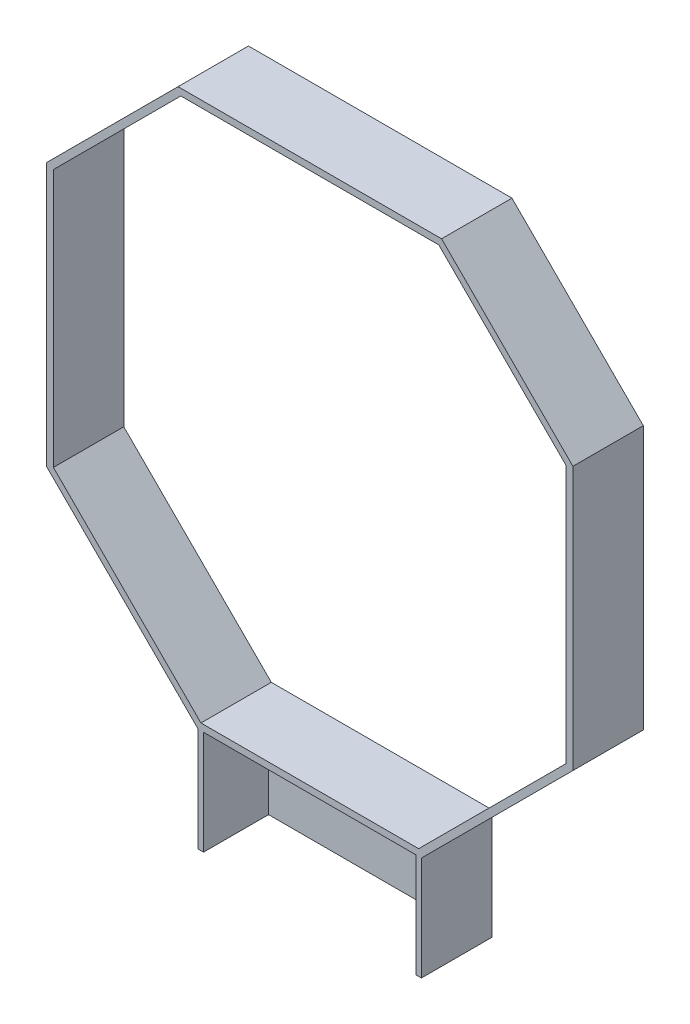
ISO-10303-21;
HEADER;
FILE_DESCRIPTION(('STEP AP214'),'2;1');
FILE_NAME('part.step','',(''),(''),'','','');
FILE_SCHEMA(('AUTOMOTIVE_DESIGN { 1 0 10303 214 1 1 1 1 }'));
ENDSEC;
DATA;
#1=APPLICATION_CONTEXT('core data for automotive mechanical design processes');
#2=APPLICATION_PROTOCOL_DEFINITION('international standard','automotive_design',2000,#1);
#3=PRODUCT_CONTEXT('',#1,'mechanical');
#4=PRODUCT('Part','Part','',(#3));
#5=PRODUCT_RELATED_PRODUCT_CATEGORY('part','',(#4));
#6=PRODUCT_DEFINITION_FORMATION('','',#4);
#7=PRODUCT_DEFINITION_CONTEXT('part definition',#1,'design');
#8=PRODUCT_DEFINITION('design','',#6,#7);
#9=PRODUCT_DEFINITION_SHAPE('','',#8);
#10=(LENGTH_UNIT() NAMED_UNIT(*) SI_UNIT(.MILLI.,.METRE.));
#11=(NAMED_UNIT(*) PLANE_ANGLE_UNIT() SI_UNIT($,.RADIAN.));
#12=(NAMED_UNIT(*) SI_UNIT($,.STERADIAN.) SOLID_ANGLE_UNIT());
#13=UNCERTAINTY_MEASURE_WITH_UNIT(LENGTH_MEASURE(1.E-05),#10,'distance_accuracy_value','');
#14=(GEOMETRIC_REPRESENTATION_CONTEXT(3) GLOBAL_UNCERTAINTY_ASSIGNED_CONTEXT((#13)) GLOBAL_UNIT_ASSIGNED_CONTEXT((#10,
#11,#12)) REPRESENTATION_CONTEXT('',''));
#15=CARTESIAN_POINT('',(0.,0.,0.));
#16=DIRECTION('',(0.,0.,1.));
#17=DIRECTION('',(1.,0.,0.));
#18=AXIS2_PLACEMENT_3D('',#15,#16,#17);
#19=CARTESIAN_POINT('',(21.125,20.375,4.5));
#20=DIRECTION('',(0.,0.,1.));
#21=DIRECTION('',(1.,0.,0.));
#22=AXIS2_PLACEMENT_3D('',#19,#20,#21);
#23=PLANE('',#22);
#24=DIRECTION('',(0.707106781186548,-0.707106781186548,0.));
#25=VECTOR('',#24,1.);
#26=CARTESIAN_POINT('',(30.7447961799572,40.25,4.5));
#27=LINE('',#26,#25);
#28=CARTESIAN_POINT('',(30.7447961799572,40.25,4.5));
#29=VERTEX_POINT('',#28);
#30=CARTESIAN_POINT('',(40.25,30.7447961799572,4.5));
#31=VERTEX_POINT('',#30);
#32=EDGE_CURVE('E286',#29,#31,#27,.T.);
#33=ORIENTED_EDGE('',*,*,#32,.F.);
#34=DIRECTION('',(1.,0.,0.));
#35=VECTOR('',#34,1.);
#36=CARTESIAN_POINT('',(11.5052038200428,40.25,4.5));
#37=LINE('',#36,#35);
#38=CARTESIAN_POINT('',(11.5052038200428,40.25,4.5));
#39=VERTEX_POINT('',#38);
#40=EDGE_CURVE('E322',#39,#29,#37,.T.);
#41=ORIENTED_EDGE('',*,*,#40,.F.);
#42=DIRECTION('',(0.707106781186548,0.707106781186547,0.));
#43=VECTOR('',#42,1.);
#44=CARTESIAN_POINT('',(2.,30.7447961799572,4.5));
#45=LINE('',#44,#43);
#46=CARTESIAN_POINT('',(2.,30.7447961799572,4.5));
#47=VERTEX_POINT('',#46);
#48=EDGE_CURVE('E398',#47,#39,#45,.T.);
#49=ORIENTED_EDGE('',*,*,#48,.F.);
#50=DIRECTION('',(0.,1.,0.));
#51=VECTOR('',#50,1.);
#52=CARTESIAN_POINT('',(2.,11.5052038200428,4.5));
#53=LINE('',#52,#51);
#54=CARTESIAN_POINT('',(2.,11.5052038200428,4.5));
#55=VERTEX_POINT('',#54);
#56=EDGE_CURVE('E221',#55,#47,#53,.T.);
#57=ORIENTED_EDGE('',*,*,#56,.F.);
#58=DIRECTION('',(-0.707106781186548,0.707106781186547,0.));
#59=VECTOR('',#58,1.);
#60=CARTESIAN_POINT('',(13.0052038200428,0.5,4.5));
#61=LINE('',#60,#59);
#62=CARTESIAN_POINT('',(13.0052038200428,0.5,4.5));
#63=VERTEX_POINT('',#62);
#64=EDGE_CURVE('E189',#63,#55,#61,.T.);
#65=ORIENTED_EDGE('',*,*,#64,.F.);
#66=DIRECTION('',(-1.,0.,0.));
#67=VECTOR('',#66,1.);
#68=CARTESIAN_POINT('',(29.2447961799572,0.5,4.5));
#69=LINE('',#68,#67);
#70=CARTESIAN_POINT('',(29.2447961799572,0.5,4.5));
#71=VERTEX_POINT('',#70);
#72=EDGE_CURVE('E207',#71,#63,#69,.T.);
#73=ORIENTED_EDGE('',*,*,#72,.F.);
#74=DIRECTION('',(-0.707106781186548,-0.707106781186547,0.));
#75=VECTOR('',#74,1.);
#76=CARTESIAN_POINT('',(40.25,11.5052038200428,4.5));
#77=LINE('',#76,#75);
#78=CARTESIAN_POINT('',(40.25,11.5052038200428,4.5));
#79=VERTEX_POINT('',#78);
#80=EDGE_CURVE('E346',#79,#71,#77,.T.);
#81=ORIENTED_EDGE('',*,*,#80,.F.);
#82=DIRECTION('',(0.,-1.,0.));
#83=VECTOR('',#82,1.);
#84=CARTESIAN_POINT('',(40.25,30.7447961799572,4.5));
#85=LINE('',#84,#83);
#86=EDGE_CURVE('E271',#31,#79,#85,.T.);
#87=ORIENTED_EDGE('',*,*,#86,.F.);
#88=EDGE_LOOP('',(#33,#41,#49,#57,#65,#73,#81,#87));
#89=FACE_BOUND('',#88,.T.);
#90=DIRECTION('',(0.,1.,0.));
#91=VECTOR('',#90,1.);
#92=CARTESIAN_POINT('',(1.5,11.2980970388563,4.5));
#93=LINE('',#92,#91);
#94=CARTESIAN_POINT('',(1.5,11.2980970388563,4.5));
#95=VERTEX_POINT('',#94);
#96=CARTESIAN_POINT('',(1.5,30.9519029611437,4.5));
#97=VERTEX_POINT('',#96);
#98=EDGE_CURVE('E28',#95,#97,#93,.T.);
#99=ORIENTED_EDGE('',*,*,#98,.T.);
#100=DIRECTION('',(0.707106781186548,0.707106781186547,0.));
#101=VECTOR('',#100,1.);
#102=CARTESIAN_POINT('',(1.5,30.9519029611437,4.5));
#103=LINE('',#102,#101);
#104=CARTESIAN_POINT('',(11.2980970388563,40.75,4.5));
#105=VERTEX_POINT('',#104);
#106=EDGE_CURVE('E200',#97,#105,#103,.T.);
#107=ORIENTED_EDGE('',*,*,#106,.T.);
#108=DIRECTION('',(1.,0.,0.));
#109=VECTOR('',#108,1.);
#110=CARTESIAN_POINT('',(11.2980970388563,40.75,4.5));
#111=LINE('',#110,#109);
#112=CARTESIAN_POINT('',(30.9519029611437,40.75,4.5));
#113=VERTEX_POINT('',#112);
#114=EDGE_CURVE('E244',#105,#113,#111,.T.);
#115=ORIENTED_EDGE('',*,*,#114,.T.);
#116=DIRECTION('',(0.707106781186548,-0.707106781186548,0.));
#117=VECTOR('',#116,1.);
#118=CARTESIAN_POINT('',(30.9519029611437,40.75,4.5));
#119=LINE('',#118,#117);
#120=CARTESIAN_POINT('',(40.75,30.9519029611437,4.5));
#121=VERTEX_POINT('',#120);
#122=EDGE_CURVE('E180',#113,#121,#119,.T.);
#123=ORIENTED_EDGE('',*,*,#122,.T.);
#124=DIRECTION('',(0.,-1.,0.));
#125=VECTOR('',#124,1.);
#126=CARTESIAN_POINT('',(40.75,30.9519029611437,4.5));
#127=LINE('',#126,#125);
#128=CARTESIAN_POINT('',(40.75,11.2980970388563,4.5));
#129=VERTEX_POINT('',#128);
#130=EDGE_CURVE('E164',#121,#129,#127,.T.);
#131=ORIENTED_EDGE('',*,*,#130,.T.);
#132=DIRECTION('',(-0.707106781186548,-0.707106781186547,0.));
#133=VECTOR('',#132,1.);
#134=CARTESIAN_POINT('',(40.75,11.2980970388563,4.5));
#135=LINE('',#134,#133);
#136=CARTESIAN_POINT('',(29.4519029611437,0.,4.5));
#137=VERTEX_POINT('',#136);
#138=EDGE_CURVE('E194',#129,#137,#135,.T.);
#139=ORIENTED_EDGE('',*,*,#138,.T.);
#140=DIRECTION('',(0.,-1.,0.));
#141=VECTOR('',#140,1.);
#142=CARTESIAN_POINT('',(29.4519029611437,0.,4.5));
#143=LINE('',#142,#141);
#144=CARTESIAN_POINT('',(29.4519029611437,-7.75,4.5));
#145=VERTEX_POINT('',#144);
#146=EDGE_CURVE('E327',#137,#145,#143,.T.);
#147=ORIENTED_EDGE('',*,*,#146,.T.);
#148=DIRECTION('',(1.,0.,0.));
#149=VECTOR('',#148,1.);
#150=CARTESIAN_POINT('',(12.7980970388563,-7.75,4.5));
#151=LINE('',#150,#149);
#152=CARTESIAN_POINT('',(12.7980970388563,-7.75,4.5));
#153=VERTEX_POINT('',#152);
#154=EDGE_CURVE('E215',#153,#145,#151,.T.);
#155=ORIENTED_EDGE('',*,*,#154,.F.);
#156=DIRECTION('',(0.,-1.,0.));
#157=VECTOR('',#156,1.);
#158=CARTESIAN_POINT('',(12.7980970388563,0.,4.5));
#159=LINE('',#158,#157);
#160=CARTESIAN_POINT('',(12.7980970388563,0.,4.5));
#161=VERTEX_POINT('',#160);
#162=EDGE_CURVE('E351',#161,#153,#159,.T.);
#163=ORIENTED_EDGE('',*,*,#162,.F.);
#164=DIRECTION('',(-0.707106781186548,0.707106781186547,0.));
#165=VECTOR('',#164,1.);
#166=CARTESIAN_POINT('',(12.7980970388563,0.,4.5));
#167=LINE('',#166,#165);
#168=EDGE_CURVE('E214',#161,#95,#167,.T.);
#169=ORIENTED_EDGE('',*,*,#168,.T.);
#170=EDGE_LOOP('',(#99,#107,#115,#123,#131,#139,#147,#155,#163,#169));
#171=FACE_BOUND('',#170,.T.);
#172=ADVANCED_FACE('F17',(#89,#171),#23,.F.);
#173=CARTESIAN_POINT('',(21.125,20.375,9.75));
#174=DIRECTION('',(0.,0.,1.));
#175=DIRECTION('',(1.,0.,0.));
#176=AXIS2_PLACEMENT_3D('',#173,#174,#175);
#177=PLANE('',#176);
#178=DIRECTION('',(0.707106781186548,-0.707106781186548,0.));
#179=VECTOR('',#178,1.);
#180=CARTESIAN_POINT('',(30.7447961799572,40.25,9.75));
#181=LINE('',#180,#179);
#182=CARTESIAN_POINT('',(30.7447961799572,40.25,9.75));
#183=VERTEX_POINT('',#182);
#184=CARTESIAN_POINT('',(40.25,30.7447961799572,9.75));
#185=VERTEX_POINT('',#184);
#186=EDGE_CURVE('E293',#183,#185,#181,.T.);
#187=ORIENTED_EDGE('',*,*,#186,.T.);
#188=DIRECTION('',(0.,-1.,0.));
#189=VECTOR('',#188,1.);
#190=CARTESIAN_POINT('',(40.25,30.7447961799572,9.75));
#191=LINE('',#190,#189);
#192=CARTESIAN_POINT('',(40.25,11.5052038200428,9.75));
#193=VERTEX_POINT('',#192);
#194=EDGE_CURVE('E287',#185,#193,#191,.T.);
#195=ORIENTED_EDGE('',*,*,#194,.T.);
#196=DIRECTION('',(-0.707106781186548,-0.707106781186547,0.));
#197=VECTOR('',#196,1.);
#198=CARTESIAN_POINT('',(40.25,11.5052038200428,9.75));
#199=LINE('',#198,#197);
#200=CARTESIAN_POINT('',(29.2447961799572,0.5,9.75));
#201=VERTEX_POINT('',#200);
#202=EDGE_CURVE('E272',#193,#201,#199,.T.);
#203=ORIENTED_EDGE('',*,*,#202,.T.);
#204=DIRECTION('',(-1.,0.,0.));
#205=VECTOR('',#204,1.);
#206=CARTESIAN_POINT('',(29.2447961799572,0.5,9.75));
#207=LINE('',#206,#205);
#208=CARTESIAN_POINT('',(13.0052038200428,0.5,9.75));
#209=VERTEX_POINT('',#208);
#210=EDGE_CURVE('E288',#201,#209,#207,.T.);
#211=ORIENTED_EDGE('',*,*,#210,.T.);
#212=DIRECTION('',(-0.707106781186548,0.707106781186547,0.));
#213=VECTOR('',#212,1.);
#214=CARTESIAN_POINT('',(13.0052038200428,0.5,9.75));
#215=LINE('',#214,#213);
#216=CARTESIAN_POINT('',(2.,11.5052038200428,9.75));
#217=VERTEX_POINT('',#216);
#218=EDGE_CURVE('E208',#209,#217,#215,.T.);
#219=ORIENTED_EDGE('',*,*,#218,.T.);
#220=DIRECTION('',(0.,1.,0.));
#221=VECTOR('',#220,1.);
#222=CARTESIAN_POINT('',(2.,11.5052038200428,9.75));
#223=LINE('',#222,#221);
#224=CARTESIAN_POINT('',(2.,30.7447961799572,9.75));
#225=VERTEX_POINT('',#224);
#226=EDGE_CURVE('E224',#217,#225,#223,.T.);
#227=ORIENTED_EDGE('',*,*,#226,.T.);
#228=DIRECTION('',(0.707106781186548,0.707106781186547,0.));
#229=VECTOR('',#228,1.);
#230=CARTESIAN_POINT('',(2.,30.7447961799572,9.75));
#231=LINE('',#230,#229);
#232=CARTESIAN_POINT('',(11.5052038200428,40.25,9.75));
#233=VERTEX_POINT('',#232);
#234=EDGE_CURVE('E402',#225,#233,#231,.T.);
#235=ORIENTED_EDGE('',*,*,#234,.T.);
#236=DIRECTION('',(1.,0.,0.));
#237=VECTOR('',#236,1.);
#238=CARTESIAN_POINT('',(11.5052038200428,40.25,9.75));
#239=LINE('',#238,#237);
#240=EDGE_CURVE('E273',#233,#183,#239,.T.);
#241=ORIENTED_EDGE('',*,*,#240,.T.);
#242=EDGE_LOOP('',(#187,#195,#203,#211,#219,#227,#235,#241));
#243=FACE_BOUND('',#242,.T.);
#244=DIRECTION('',(0.,-1.,0.));
#245=VECTOR('',#244,1.);
#246=CARTESIAN_POINT('',(1.5,11.2980970388563,9.75));
#247=LINE('',#246,#245);
#248=CARTESIAN_POINT('',(1.5,30.9519029611437,9.75));
#249=VERTEX_POINT('',#248);
#250=CARTESIAN_POINT('',(1.5,11.2980970388563,9.75));
#251=VERTEX_POINT('',#250);
#252=EDGE_CURVE('E11',#249,#251,#247,.T.);
#253=ORIENTED_EDGE('',*,*,#252,.T.);
#254=DIRECTION('',(0.707106781186548,-0.707106781186547,0.));
#255=VECTOR('',#254,1.);
#256=CARTESIAN_POINT('',(12.7980970388563,0.,9.75));
#257=LINE('',#256,#255);
#258=CARTESIAN_POINT('',(12.7980970388563,0.,9.75));
#259=VERTEX_POINT('',#258);
#260=EDGE_CURVE('E313',#251,#259,#257,.T.);
#261=ORIENTED_EDGE('',*,*,#260,.T.);
#262=DIRECTION('',(0.,-1.,0.));
#263=VECTOR('',#262,1.);
#264=CARTESIAN_POINT('',(12.7980970388563,0.,9.75));
#265=LINE('',#264,#263);
#266=CARTESIAN_POINT('',(12.7980970388563,-7.75,9.75));
#267=VERTEX_POINT('',#266);
#268=EDGE_CURVE('E339',#259,#267,#265,.T.);
#269=ORIENTED_EDGE('',*,*,#268,.T.);
#270=DIRECTION('',(-1.,0.,0.));
#271=VECTOR('',#270,1.);
#272=CARTESIAN_POINT('',(29.4519029611437,-7.75,9.75));
#273=LINE('',#272,#271);
#274=CARTESIAN_POINT('',(13.1980970388563,-7.75,9.74999978207052));
#275=VERTEX_POINT('',#274);
#276=EDGE_CURVE('E220',#275,#267,#273,.T.);
#277=ORIENTED_EDGE('',*,*,#276,.F.);
#278=DIRECTION('',(0.,-1.,0.));
#279=VECTOR('',#278,1.);
#280=CARTESIAN_POINT('',(13.1980970388563,0.,9.74999978207052));
#281=LINE('',#280,#279);
#282=CARTESIAN_POINT('',(13.1980970388563,0.,9.74999978207052));
#283=VERTEX_POINT('',#282);
#284=EDGE_CURVE('E262',#283,#275,#281,.T.);
#285=ORIENTED_EDGE('',*,*,#284,.F.);
#286=DIRECTION('',(1.,0.,0.));
#287=VECTOR('',#286,1.);
#288=CARTESIAN_POINT('',(29.4519029611437,0.,9.75));
#289=LINE('',#288,#287);
#290=CARTESIAN_POINT('',(29.0519029611437,0.,9.75));
#291=VERTEX_POINT('',#290);
#292=EDGE_CURVE('E193',#283,#291,#289,.T.);
#293=ORIENTED_EDGE('',*,*,#292,.T.);
#294=DIRECTION('',(0.,-1.,0.));
#295=VECTOR('',#294,1.);
#296=CARTESIAN_POINT('',(29.0519029611437,0.,9.75));
#297=LINE('',#296,#295);
#298=CARTESIAN_POINT('',(29.0519029611437,-7.75,9.75));
#299=VERTEX_POINT('',#298);
#300=EDGE_CURVE('E21',#291,#299,#297,.T.);
#301=ORIENTED_EDGE('',*,*,#300,.T.);
#302=DIRECTION('',(-1.,0.,0.));
#303=VECTOR('',#302,1.);
#304=CARTESIAN_POINT('',(29.4519029611437,-7.75,9.75));
#305=LINE('',#304,#303);
#306=CARTESIAN_POINT('',(29.4519029611437,-7.75,9.75));
#307=VERTEX_POINT('',#306);
#308=EDGE_CURVE('E219',#307,#299,#305,.T.);
#309=ORIENTED_EDGE('',*,*,#308,.F.);
#310=DIRECTION('',(0.,-1.,0.));
#311=VECTOR('',#310,1.);
#312=CARTESIAN_POINT('',(29.4519029611437,0.,9.75));
#313=LINE('',#312,#311);
#314=CARTESIAN_POINT('',(29.4519029611437,0.,9.75));
#315=VERTEX_POINT('',#314);
#316=EDGE_CURVE('E240',#315,#307,#313,.T.);
#317=ORIENTED_EDGE('',*,*,#316,.F.);
#318=DIRECTION('',(0.707106781186548,0.707106781186547,0.));
#319=VECTOR('',#318,1.);
#320=CARTESIAN_POINT('',(40.75,11.2980970388563,9.75));
#321=LINE('',#320,#319);
#322=CARTESIAN_POINT('',(40.75,11.2980970388563,9.75));
#323=VERTEX_POINT('',#322);
#324=EDGE_CURVE('E158',#315,#323,#321,.T.);
#325=ORIENTED_EDGE('',*,*,#324,.T.);
#326=DIRECTION('',(0.,1.,0.));
#327=VECTOR('',#326,1.);
#328=CARTESIAN_POINT('',(40.75,30.9519029611437,9.75));
#329=LINE('',#328,#327);
#330=CARTESIAN_POINT('',(40.75,30.9519029611437,9.75));
#331=VERTEX_POINT('',#330);
#332=EDGE_CURVE('E149',#323,#331,#329,.T.);
#333=ORIENTED_EDGE('',*,*,#332,.T.);
#334=DIRECTION('',(-0.707106781186548,0.707106781186548,0.));
#335=VECTOR('',#334,1.);
#336=CARTESIAN_POINT('',(30.9519029611437,40.75,9.75));
#337=LINE('',#336,#335);
#338=CARTESIAN_POINT('',(30.9519029611437,40.75,9.75));
#339=VERTEX_POINT('',#338);
#340=EDGE_CURVE('E154',#331,#339,#337,.T.);
#341=ORIENTED_EDGE('',*,*,#340,.T.);
#342=DIRECTION('',(-1.,0.,0.));
#343=VECTOR('',#342,1.);
#344=CARTESIAN_POINT('',(11.2980970388563,40.75,9.75));
#345=LINE('',#344,#343);
#346=CARTESIAN_POINT('',(11.2980970388563,40.75,9.75));
#347=VERTEX_POINT('',#346);
#348=EDGE_CURVE('E254',#339,#347,#345,.T.);
#349=ORIENTED_EDGE('',*,*,#348,.T.);
#350=DIRECTION('',(-0.707106781186548,-0.707106781186547,0.));
#351=VECTOR('',#350,1.);
#352=CARTESIAN_POINT('',(1.5,30.9519029611437,9.75));
#353=LINE('',#352,#351);
#354=EDGE_CURVE('E199',#347,#249,#353,.T.);
#355=ORIENTED_EDGE('',*,*,#354,.T.);
#356=EDGE_LOOP('',(#253,#261,#269,#277,#285,#293,#301,#309,#317,#325,#333,#341,#349,#355));
#357=FACE_BOUND('',#356,.T.);
#358=ADVANCED_FACE('F151',(#243,#357),#177,.T.);
#359=CARTESIAN_POINT('',(1.5,30.9519029611437,4.5));
#360=DIRECTION('',(-1.,0.,0.));
#361=DIRECTION('',(0.,1.,0.));
#362=AXIS2_PLACEMENT_3D('',#359,#360,#361);
#363=PLANE('',#362);
#364=ORIENTED_EDGE('',*,*,#98,.F.);
#365=DIRECTION('',(0.,0.,1.));
#366=VECTOR('',#365,1.);
#367=CARTESIAN_POINT('',(1.5,11.2980970388563,4.5));
#368=LINE('',#367,#366);
#369=EDGE_CURVE('E362',#95,#251,#368,.T.);
#370=ORIENTED_EDGE('',*,*,#369,.T.);
#371=ORIENTED_EDGE('',*,*,#252,.F.);
#372=DIRECTION('',(0.,0.,1.));
#373=VECTOR('',#372,1.);
#374=CARTESIAN_POINT('',(1.5,30.9519029611437,4.5));
#375=LINE('',#374,#373);
#376=EDGE_CURVE('E195',#97,#249,#375,.T.);
#377=ORIENTED_EDGE('',*,*,#376,.F.);
#378=EDGE_LOOP('',(#364,#370,#371,#377));
#379=FACE_BOUND('',#378,.T.);
#380=ADVANCED_FACE('F769',(#379),#363,.T.);
#381=CARTESIAN_POINT('',(1.5,11.2980970388563,4.5));
#382=DIRECTION('',(-0.707106781186547,-0.707106781186548,0.));
#383=DIRECTION('',(-0.707106781186548,0.707106781186547,0.));
#384=AXIS2_PLACEMENT_3D('',#381,#382,#383);
#385=PLANE('',#384);
#386=ORIENTED_EDGE('',*,*,#168,.F.);
#387=DIRECTION('',(0.,0.,1.));
#388=VECTOR('',#387,1.);
#389=CARTESIAN_POINT('',(12.7980970388563,0.,4.5));
#390=LINE('',#389,#388);
#391=EDGE_CURVE('E331',#161,#259,#390,.T.);
#392=ORIENTED_EDGE('',*,*,#391,.T.);
#393=ORIENTED_EDGE('',*,*,#260,.F.);
#394=ORIENTED_EDGE('',*,*,#369,.F.);
#395=EDGE_LOOP('',(#386,#392,#393,#394));
#396=FACE_BOUND('',#395,.T.);
#397=ADVANCED_FACE('F497',(#396),#385,.T.);
#398=CARTESIAN_POINT('',(12.7980970388563,0.,4.5));
#399=DIRECTION('',(0.,-1.,0.));
#400=DIRECTION('',(0.,0.,-1.));
#401=AXIS2_PLACEMENT_3D('',#398,#399,#400);
#402=PLANE('',#401);
#403=DIRECTION('',(0.,0.,1.));
#404=VECTOR('',#403,1.);
#405=CARTESIAN_POINT('',(29.0519029611437,0.,7.125));
#406=LINE('',#405,#404);
#407=CARTESIAN_POINT('',(29.0519029611437,0.,4.9));
#408=VERTEX_POINT('',#407);
#409=EDGE_CURVE('E236',#408,#291,#406,.T.);
#410=ORIENTED_EDGE('',*,*,#409,.T.);
#411=ORIENTED_EDGE('',*,*,#292,.F.);
#412=DIRECTION('',(0.,0.,-1.));
#413=VECTOR('',#412,1.);
#414=CARTESIAN_POINT('',(13.1980970388563,0.,4.7));
#415=LINE('',#414,#413);
#416=CARTESIAN_POINT('',(13.1980970388563,0.,4.9));
#417=VERTEX_POINT('',#416);
#418=EDGE_CURVE('E267',#283,#417,#415,.T.);
#419=ORIENTED_EDGE('',*,*,#418,.T.);
#420=DIRECTION('',(1.,0.,0.));
#421=VECTOR('',#420,1.);
#422=CARTESIAN_POINT('',(20.925,0.,4.9));
#423=LINE('',#422,#421);
#424=EDGE_CURVE('E231',#417,#408,#423,.T.);
#425=ORIENTED_EDGE('',*,*,#424,.T.);
#426=EDGE_LOOP('',(#410,#411,#419,#425));
#427=FACE_BOUND('',#426,.T.);
#428=ADVANCED_FACE('F511',(#427),#402,.T.);
#429=CARTESIAN_POINT('',(29.4519029611437,0.,4.5));
#430=DIRECTION('',(0.707106781186547,-0.707106781186548,0.));
#431=DIRECTION('',(0.,0.,-1.));
#432=AXIS2_PLACEMENT_3D('',#429,#430,#431);
#433=PLANE('',#432);
#434=ORIENTED_EDGE('',*,*,#138,.F.);
#435=DIRECTION('',(0.,0.,1.));
#436=VECTOR('',#435,1.);
#437=CARTESIAN_POINT('',(40.75,11.2980970388563,4.5));
#438=LINE('',#437,#436);
#439=EDGE_CURVE('E163',#129,#323,#438,.T.);
#440=ORIENTED_EDGE('',*,*,#439,.T.);
#441=ORIENTED_EDGE('',*,*,#324,.F.);
#442=DIRECTION('',(0.,0.,1.));
#443=VECTOR('',#442,1.);
#444=CARTESIAN_POINT('',(29.4519029611437,0.,4.5));
#445=LINE('',#444,#443);
#446=EDGE_CURVE('E237',#137,#315,#445,.T.);
#447=ORIENTED_EDGE('',*,*,#446,.F.);
#448=EDGE_LOOP('',(#434,#440,#441,#447));
#449=FACE_BOUND('',#448,.T.);
#450=ADVANCED_FACE('F780',(#449),#433,.T.);
#451=CARTESIAN_POINT('',(40.75,11.2980970388563,4.5));
#452=DIRECTION('',(1.,0.,0.));
#453=DIRECTION('',(0.,1.,0.));
#454=AXIS2_PLACEMENT_3D('',#451,#452,#453);
#455=PLANE('',#454);
#456=ORIENTED_EDGE('',*,*,#130,.F.);
#457=DIRECTION('',(0.,0.,1.));
#458=VECTOR('',#457,1.);
#459=CARTESIAN_POINT('',(40.75,30.9519029611437,4.5));
#460=LINE('',#459,#458);
#461=EDGE_CURVE('E167',#121,#331,#460,.T.);
#462=ORIENTED_EDGE('',*,*,#461,.T.);
#463=ORIENTED_EDGE('',*,*,#332,.F.);
#464=ORIENTED_EDGE('',*,*,#439,.F.);
#465=EDGE_LOOP('',(#456,#462,#463,#464));
#466=FACE_BOUND('',#465,.T.);
#467=ADVANCED_FACE('F168',(#466),#455,.T.);
#468=CARTESIAN_POINT('',(40.75,30.9519029611437,4.5));
#469=DIRECTION('',(0.707106781186548,0.707106781186548,0.));
#470=DIRECTION('',(0.,0.,-1.));
#471=AXIS2_PLACEMENT_3D('',#468,#469,#470);
#472=PLANE('',#471);
#473=ORIENTED_EDGE('',*,*,#122,.F.);
#474=DIRECTION('',(0.,0.,1.));
#475=VECTOR('',#474,1.);
#476=CARTESIAN_POINT('',(30.9519029611437,40.75,4.5));
#477=LINE('',#476,#475);
#478=EDGE_CURVE('E177',#113,#339,#477,.T.);
#479=ORIENTED_EDGE('',*,*,#478,.T.);
#480=ORIENTED_EDGE('',*,*,#340,.F.);
#481=ORIENTED_EDGE('',*,*,#461,.F.);
#482=EDGE_LOOP('',(#473,#479,#480,#481));
#483=FACE_BOUND('',#482,.T.);
#484=ADVANCED_FACE('F175',(#483),#472,.T.);
#485=CARTESIAN_POINT('',(30.9519029611437,40.75,4.5));
#486=DIRECTION('',(0.,1.,0.));
#487=DIRECTION('',(1.,0.,0.));
#488=AXIS2_PLACEMENT_3D('',#485,#486,#487);
#489=PLANE('',#488);
#490=ORIENTED_EDGE('',*,*,#114,.F.);
#491=DIRECTION('',(0.,0.,1.));
#492=VECTOR('',#491,1.);
#493=CARTESIAN_POINT('',(11.2980970388563,40.75,4.5));
#494=LINE('',#493,#492);
#495=EDGE_CURVE('E241',#105,#347,#494,.T.);
#496=ORIENTED_EDGE('',*,*,#495,.T.);
#497=ORIENTED_EDGE('',*,*,#348,.F.);
#498=ORIENTED_EDGE('',*,*,#478,.F.);
#499=EDGE_LOOP('',(#490,#496,#497,#498));
#500=FACE_BOUND('',#499,.T.);
#501=ADVANCED_FACE('F776',(#500),#489,.T.);
#502=CARTESIAN_POINT('',(11.2980970388563,40.75,4.5));
#503=DIRECTION('',(-0.707106781186547,0.707106781186548,0.));
#504=DIRECTION('',(0.,0.,1.));
#505=AXIS2_PLACEMENT_3D('',#502,#503,#504);
#506=PLANE('',#505);
#507=ORIENTED_EDGE('',*,*,#106,.F.);
#508=ORIENTED_EDGE('',*,*,#376,.T.);
#509=ORIENTED_EDGE('',*,*,#354,.F.);
#510=ORIENTED_EDGE('',*,*,#495,.F.);
#511=EDGE_LOOP('',(#507,#508,#509,#510));
#512=FACE_BOUND('',#511,.T.);
#513=ADVANCED_FACE('F760',(#512),#506,.T.);
#514=CARTESIAN_POINT('',(30.7447961799572,40.25,4.5));
#515=DIRECTION('',(-0.707106781186548,-0.707106781186548,0.));
#516=DIRECTION('',(-0.707106781186548,0.707106781186548,0.));
#517=AXIS2_PLACEMENT_3D('',#514,#515,#516);
#518=PLANE('',#517);
#519=ORIENTED_EDGE('',*,*,#32,.T.);
#520=DIRECTION('',(0.,0.,1.));
#521=VECTOR('',#520,1.);
#522=CARTESIAN_POINT('',(40.25,30.7447961799572,4.5));
#523=LINE('',#522,#521);
#524=EDGE_CURVE('E282',#31,#185,#523,.T.);
#525=ORIENTED_EDGE('',*,*,#524,.T.);
#526=ORIENTED_EDGE('',*,*,#186,.F.);
#527=DIRECTION('',(0.,0.,1.));
#528=VECTOR('',#527,1.);
#529=CARTESIAN_POINT('',(30.7447961799572,40.25,4.5));
#530=LINE('',#529,#528);
#531=EDGE_CURVE('E278',#29,#183,#530,.T.);
#532=ORIENTED_EDGE('',*,*,#531,.F.);
#533=EDGE_LOOP('',(#519,#525,#526,#532));
#534=FACE_BOUND('',#533,.T.);
#535=ADVANCED_FACE('F750',(#534),#518,.T.);
#536=CARTESIAN_POINT('',(40.25,30.7447961799572,4.5));
#537=DIRECTION('',(-1.,0.,0.));
#538=DIRECTION('',(0.,0.,1.));
#539=AXIS2_PLACEMENT_3D('',#536,#537,#538);
#540=PLANE('',#539);
#541=ORIENTED_EDGE('',*,*,#86,.T.);
#542=DIRECTION('',(0.,0.,1.));
#543=VECTOR('',#542,1.);
#544=CARTESIAN_POINT('',(40.25,11.5052038200428,4.5));
#545=LINE('',#544,#543);
#546=EDGE_CURVE('E268',#79,#193,#545,.T.);
#547=ORIENTED_EDGE('',*,*,#546,.T.);
#548=ORIENTED_EDGE('',*,*,#194,.F.);
#549=ORIENTED_EDGE('',*,*,#524,.F.);
#550=EDGE_LOOP('',(#541,#547,#548,#549));
#551=FACE_BOUND('',#550,.T.);
#552=ADVANCED_FACE('F751',(#551),#540,.T.);
#553=CARTESIAN_POINT('',(40.25,11.5052038200428,4.5));
#554=DIRECTION('',(-0.707106781186547,0.707106781186548,0.));
#555=DIRECTION('',(0.,0.,1.));
#556=AXIS2_PLACEMENT_3D('',#553,#554,#555);
#557=PLANE('',#556);
#558=ORIENTED_EDGE('',*,*,#80,.T.);
#559=DIRECTION('',(0.,0.,1.));
#560=VECTOR('',#559,1.);
#561=CARTESIAN_POINT('',(29.2447961799572,0.5,4.5));
#562=LINE('',#561,#560);
#563=EDGE_CURVE('E290',#71,#201,#562,.T.);
#564=ORIENTED_EDGE('',*,*,#563,.T.);
#565=ORIENTED_EDGE('',*,*,#202,.F.);
#566=ORIENTED_EDGE('',*,*,#546,.F.);
#567=EDGE_LOOP('',(#558,#564,#565,#566));
#568=FACE_BOUND('',#567,.T.);
#569=ADVANCED_FACE('F448',(#568),#557,.T.);
#570=CARTESIAN_POINT('',(29.2447961799572,0.5,4.5));
#571=DIRECTION('',(0.,1.,0.));
#572=DIRECTION('',(1.,0.,0.));
#573=AXIS2_PLACEMENT_3D('',#570,#571,#572);
#574=PLANE('',#573);
#575=ORIENTED_EDGE('',*,*,#72,.T.);
#576=DIRECTION('',(0.,0.,1.));
#577=VECTOR('',#576,1.);
#578=CARTESIAN_POINT('',(13.0052038200428,0.5,4.5));
#579=LINE('',#578,#577);
#580=EDGE_CURVE('E203',#63,#209,#579,.T.);
#581=ORIENTED_EDGE('',*,*,#580,.T.);
#582=ORIENTED_EDGE('',*,*,#210,.F.);
#583=ORIENTED_EDGE('',*,*,#563,.F.);
#584=EDGE_LOOP('',(#575,#581,#582,#583));
#585=FACE_BOUND('',#584,.T.);
#586=ADVANCED_FACE('F451',(#585),#574,.T.);
#587=CARTESIAN_POINT('',(13.0052038200428,0.5,4.5));
#588=DIRECTION('',(0.707106781186547,0.707106781186548,0.));
#589=DIRECTION('',(0.,0.,-1.));
#590=AXIS2_PLACEMENT_3D('',#587,#588,#589);
#591=PLANE('',#590);
#592=ORIENTED_EDGE('',*,*,#64,.T.);
#593=DIRECTION('',(0.,0.,1.));
#594=VECTOR('',#593,1.);
#595=CARTESIAN_POINT('',(2.,11.5052038200428,4.5));
#596=LINE('',#595,#594);
#597=EDGE_CURVE('E371',#55,#217,#596,.T.);
#598=ORIENTED_EDGE('',*,*,#597,.T.);
#599=ORIENTED_EDGE('',*,*,#218,.F.);
#600=ORIENTED_EDGE('',*,*,#580,.F.);
#601=EDGE_LOOP('',(#592,#598,#599,#600));
#602=FACE_BOUND('',#601,.T.);
#603=ADVANCED_FACE('F386',(#602),#591,.T.);
#604=CARTESIAN_POINT('',(2.,11.5052038200428,4.5));
#605=DIRECTION('',(1.,0.,0.));
#606=DIRECTION('',(0.,1.,0.));
#607=AXIS2_PLACEMENT_3D('',#604,#605,#606);
#608=PLANE('',#607);
#609=ORIENTED_EDGE('',*,*,#56,.T.);
#610=DIRECTION('',(0.,0.,1.));
#611=VECTOR('',#610,1.);
#612=CARTESIAN_POINT('',(2.,30.7447961799572,4.5));
#613=LINE('',#612,#611);
#614=EDGE_CURVE('E225',#47,#225,#613,.T.);
#615=ORIENTED_EDGE('',*,*,#614,.T.);
#616=ORIENTED_EDGE('',*,*,#226,.F.);
#617=ORIENTED_EDGE('',*,*,#597,.F.);
#618=EDGE_LOOP('',(#609,#615,#616,#617));
#619=FACE_BOUND('',#618,.T.);
#620=ADVANCED_FACE('F392',(#619),#608,.T.);
#621=CARTESIAN_POINT('',(2.,30.7447961799572,4.5));
#622=DIRECTION('',(0.707106781186547,-0.707106781186548,0.));
#623=DIRECTION('',(0.,0.,-1.));
#624=AXIS2_PLACEMENT_3D('',#621,#622,#623);
#625=PLANE('',#624);
#626=ORIENTED_EDGE('',*,*,#48,.T.);
#627=DIRECTION('',(0.,0.,1.));
#628=VECTOR('',#627,1.);
#629=CARTESIAN_POINT('',(11.5052038200428,40.25,4.5));
#630=LINE('',#629,#628);
#631=EDGE_CURVE('E277',#39,#233,#630,.T.);
#632=ORIENTED_EDGE('',*,*,#631,.T.);
#633=ORIENTED_EDGE('',*,*,#234,.F.);
#634=ORIENTED_EDGE('',*,*,#614,.F.);
#635=EDGE_LOOP('',(#626,#632,#633,#634));
#636=FACE_BOUND('',#635,.T.);
#637=ADVANCED_FACE('F744',(#636),#625,.T.);
#638=CARTESIAN_POINT('',(11.5052038200428,40.25,4.5));
#639=DIRECTION('',(0.,-1.,0.));
#640=DIRECTION('',(0.,0.,-1.));
#641=AXIS2_PLACEMENT_3D('',#638,#639,#640);
#642=PLANE('',#641);
#643=ORIENTED_EDGE('',*,*,#40,.T.);
#644=ORIENTED_EDGE('',*,*,#531,.T.);
#645=ORIENTED_EDGE('',*,*,#240,.F.);
#646=ORIENTED_EDGE('',*,*,#631,.F.);
#647=EDGE_LOOP('',(#643,#644,#645,#646));
#648=FACE_BOUND('',#647,.T.);
#649=ADVANCED_FACE('F748',(#648),#642,.T.);
#650=CARTESIAN_POINT('',(21.125,-7.75,7.125));
#651=DIRECTION('',(0.,-1.,0.));
#652=DIRECTION('',(0.,0.,-1.));
#653=AXIS2_PLACEMENT_3D('',#650,#651,#652);
#654=PLANE('',#653);
#655=DIRECTION('',(0.,0.,1.));
#656=VECTOR('',#655,1.);
#657=CARTESIAN_POINT('',(13.1980970388563,-7.75,9.35));
#658=LINE('',#657,#656);
#659=CARTESIAN_POINT('',(13.1980970388563,-7.75,4.9));
#660=VERTEX_POINT('',#659);
#661=EDGE_CURVE('E266',#660,#275,#658,.T.);
#662=ORIENTED_EDGE('',*,*,#661,.T.);
#663=ORIENTED_EDGE('',*,*,#276,.T.);
#664=DIRECTION('',(0.,0.,-1.));
#665=VECTOR('',#664,1.);
#666=CARTESIAN_POINT('',(12.7980970388563,-7.75,9.75));
#667=LINE('',#666,#665);
#668=EDGE_CURVE('E343',#267,#153,#667,.T.);
#669=ORIENTED_EDGE('',*,*,#668,.T.);
#670=ORIENTED_EDGE('',*,*,#154,.T.);
#671=DIRECTION('',(0.,0.,1.));
#672=VECTOR('',#671,1.);
#673=CARTESIAN_POINT('',(29.4519029611437,-7.75,4.5));
#674=LINE('',#673,#672);
#675=EDGE_CURVE('E332',#145,#307,#674,.T.);
#676=ORIENTED_EDGE('',*,*,#675,.T.);
#677=ORIENTED_EDGE('',*,*,#308,.T.);
#678=DIRECTION('',(0.,0.,-1.));
#679=VECTOR('',#678,1.);
#680=CARTESIAN_POINT('',(29.0519029611437,-7.75,9.35));
#681=LINE('',#680,#679);
#682=CARTESIAN_POINT('',(29.0519029611437,-7.75,4.9));
#683=VERTEX_POINT('',#682);
#684=EDGE_CURVE('E232',#299,#683,#681,.T.);
#685=ORIENTED_EDGE('',*,*,#684,.T.);
#686=DIRECTION('',(-1.,0.,0.));
#687=VECTOR('',#686,1.);
#688=CARTESIAN_POINT('',(13.1980970388563,-7.75,4.9));
#689=LINE('',#688,#687);
#690=EDGE_CURVE('E230',#683,#660,#689,.T.);
#691=ORIENTED_EDGE('',*,*,#690,.T.);
#692=EDGE_LOOP('',(#662,#663,#669,#670,#676,#677,#685,#691));
#693=FACE_BOUND('',#692,.T.);
#694=ADVANCED_FACE('F504',(#693),#654,.T.);
#695=CARTESIAN_POINT('',(13.1980970388563,0.,4.9));
#696=DIRECTION('',(1.,0.,0.));
#697=DIRECTION('',(0.,1.,0.));
#698=AXIS2_PLACEMENT_3D('',#695,#696,#697);
#699=PLANE('',#698);
#700=ORIENTED_EDGE('',*,*,#418,.F.);
#701=ORIENTED_EDGE('',*,*,#284,.T.);
#702=ORIENTED_EDGE('',*,*,#661,.F.);
#703=DIRECTION('',(0.,-1.,0.));
#704=VECTOR('',#703,1.);
#705=CARTESIAN_POINT('',(13.1980970388563,0.,4.9));
#706=LINE('',#705,#704);
#707=EDGE_CURVE('E226',#417,#660,#706,.T.);
#708=ORIENTED_EDGE('',*,*,#707,.F.);
#709=EDGE_LOOP('',(#700,#701,#702,#708));
#710=FACE_BOUND('',#709,.T.);
#711=ADVANCED_FACE('F508',(#710),#699,.T.);
#712=CARTESIAN_POINT('',(12.7980970388563,0.,9.75));
#713=DIRECTION('',(-1.,0.,0.));
#714=DIRECTION('',(0.,0.,1.));
#715=AXIS2_PLACEMENT_3D('',#712,#713,#714);
#716=PLANE('',#715);
#717=ORIENTED_EDGE('',*,*,#391,.F.);
#718=ORIENTED_EDGE('',*,*,#162,.T.);
#719=ORIENTED_EDGE('',*,*,#668,.F.);
#720=ORIENTED_EDGE('',*,*,#268,.F.);
#721=EDGE_LOOP('',(#717,#718,#719,#720));
#722=FACE_BOUND('',#721,.T.);
#723=ADVANCED_FACE('F500',(#722),#716,.T.);
#724=CARTESIAN_POINT('',(29.4519029611437,0.,4.5));
#725=DIRECTION('',(1.,0.,0.));
#726=DIRECTION('',(0.,1.,0.));
#727=AXIS2_PLACEMENT_3D('',#724,#725,#726);
#728=PLANE('',#727);
#729=ORIENTED_EDGE('',*,*,#446,.T.);
#730=ORIENTED_EDGE('',*,*,#316,.T.);
#731=ORIENTED_EDGE('',*,*,#675,.F.);
#732=ORIENTED_EDGE('',*,*,#146,.F.);
#733=EDGE_LOOP('',(#729,#730,#731,#732));
#734=FACE_BOUND('',#733,.T.);
#735=ADVANCED_FACE('F19',(#734),#728,.T.);
#736=CARTESIAN_POINT('',(29.0519029611437,0.,9.75));
#737=DIRECTION('',(-1.,0.,0.));
#738=DIRECTION('',(0.,0.,1.));
#739=AXIS2_PLACEMENT_3D('',#736,#737,#738);
#740=PLANE('',#739);
#741=ORIENTED_EDGE('',*,*,#409,.F.);
#742=DIRECTION('',(0.,-1.,0.));
#743=VECTOR('',#742,1.);
#744=CARTESIAN_POINT('',(29.0519029611437,0.,4.9));
#745=LINE('',#744,#743);
#746=EDGE_CURVE('E355',#408,#683,#745,.T.);
#747=ORIENTED_EDGE('',*,*,#746,.T.);
#748=ORIENTED_EDGE('',*,*,#684,.F.);
#749=ORIENTED_EDGE('',*,*,#300,.F.);
#750=EDGE_LOOP('',(#741,#747,#748,#749));
#751=FACE_BOUND('',#750,.T.);
#752=ADVANCED_FACE('F517',(#751),#740,.T.);
#753=CARTESIAN_POINT('',(29.0519029611437,0.,4.9));
#754=DIRECTION('',(0.,0.,1.));
#755=DIRECTION('',(1.,0.,0.));
#756=AXIS2_PLACEMENT_3D('',#753,#754,#755);
#757=PLANE('',#756);
#758=ORIENTED_EDGE('',*,*,#424,.F.);
#759=ORIENTED_EDGE('',*,*,#707,.T.);
#760=ORIENTED_EDGE('',*,*,#690,.F.);
#761=ORIENTED_EDGE('',*,*,#746,.F.);
#762=EDGE_LOOP('',(#758,#759,#760,#761));
#763=FACE_BOUND('',#762,.T.);
#764=ADVANCED_FACE('F783',(#763),#757,.T.);
#765=CLOSED_SHELL('',(#172,#358,#380,#397,#428,#450,#467,#484,#501,#513,#535,#552,#569,#586,
#603,#620,#637,#649,#694,#711,#723,#735,#752,#764));
#766=MANIFOLD_SOLID_BREP('B1',#765);
#767=ADVANCED_BREP_SHAPE_REPRESENTATION('',(#18,#766),#14);
#768=SHAPE_DEFINITION_REPRESENTATION(#9,#767);
ENDSEC;
END-ISO-10303-21;
